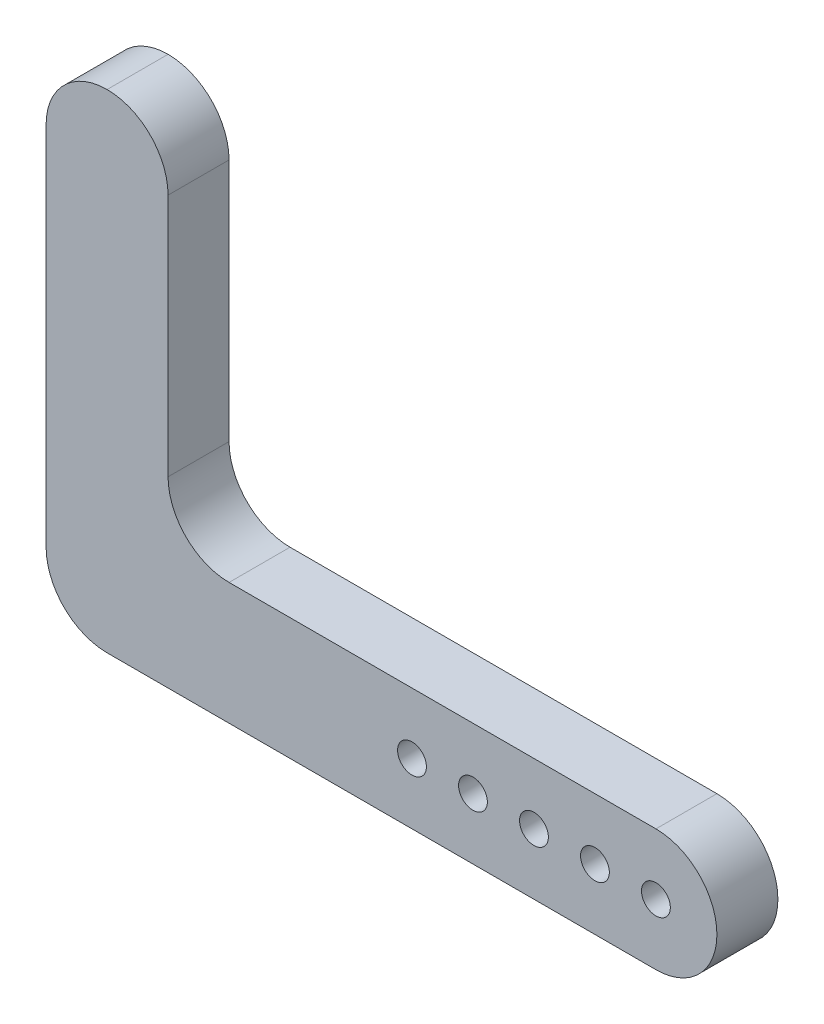
ISO-10303-21;
HEADER;
FILE_DESCRIPTION(('STEP AP214'),'2;1');
FILE_NAME('part.step','',(''),(''),'','','');
FILE_SCHEMA(('AUTOMOTIVE_DESIGN { 1 0 10303 214 1 1 1 1 }'));
ENDSEC;
DATA;
#1=APPLICATION_CONTEXT('core data for automotive mechanical design processes');
#2=APPLICATION_PROTOCOL_DEFINITION('international standard','automotive_design',2000,#1);
#3=PRODUCT_CONTEXT('',#1,'mechanical');
#4=PRODUCT('Part','Part','',(#3));
#5=PRODUCT_RELATED_PRODUCT_CATEGORY('part','',(#4));
#6=PRODUCT_DEFINITION_FORMATION('','',#4);
#7=PRODUCT_DEFINITION_CONTEXT('part definition',#1,'design');
#8=PRODUCT_DEFINITION('design','',#6,#7);
#9=PRODUCT_DEFINITION_SHAPE('','',#8);
#10=(LENGTH_UNIT() NAMED_UNIT(*) SI_UNIT(.MILLI.,.METRE.));
#11=(NAMED_UNIT(*) PLANE_ANGLE_UNIT() SI_UNIT($,.RADIAN.));
#12=(NAMED_UNIT(*) SI_UNIT($,.STERADIAN.) SOLID_ANGLE_UNIT());
#13=UNCERTAINTY_MEASURE_WITH_UNIT(LENGTH_MEASURE(1.E-05),#10,'distance_accuracy_value','');
#14=(GEOMETRIC_REPRESENTATION_CONTEXT(3) GLOBAL_UNCERTAINTY_ASSIGNED_CONTEXT((#13)) GLOBAL_UNIT_ASSIGNED_CONTEXT((#10,
#11,#12)) REPRESENTATION_CONTEXT('',''));
#15=CARTESIAN_POINT('',(0.,0.,0.));
#16=DIRECTION('',(0.,0.,1.));
#17=DIRECTION('',(1.,0.,0.));
#18=AXIS2_PLACEMENT_3D('',#15,#16,#17);
#19=CARTESIAN_POINT('',(0.,0.,6.35));
#20=DIRECTION('',(0.,0.,1.));
#21=DIRECTION('',(1.,0.,0.));
#22=AXIS2_PLACEMENT_3D('',#19,#20,#21);
#23=PLANE('',#22);
#24=CARTESIAN_POINT('',(-6.35,0.,6.35));
#25=DIRECTION('',(0.,0.,-1.));
#26=DIRECTION('',(-1.,0.,0.));
#27=AXIS2_PLACEMENT_3D('',#24,#25,#26);
#28=CIRCLE('',#27,1.5);
#29=CARTESIAN_POINT('',(-7.85,0.,6.35));
#30=VERTEX_POINT('',#29);
#31=EDGE_CURVE('E238',#30,#30,#28,.T.);
#32=ORIENTED_EDGE('',*,*,#31,.T.);
#33=EDGE_LOOP('',(#32));
#34=FACE_BOUND('',#33,.T.);
#35=CARTESIAN_POINT('',(-19.05,0.,6.35));
#36=DIRECTION('',(0.,0.,-1.));
#37=DIRECTION('',(-1.,0.,0.));
#38=AXIS2_PLACEMENT_3D('',#35,#36,#37);
#39=CIRCLE('',#38,1.5);
#40=CARTESIAN_POINT('',(-20.55,0.,6.35));
#41=VERTEX_POINT('',#40);
#42=EDGE_CURVE('E248',#41,#41,#39,.T.);
#43=ORIENTED_EDGE('',*,*,#42,.T.);
#44=EDGE_LOOP('',(#43));
#45=FACE_BOUND('',#44,.T.);
#46=CARTESIAN_POINT('',(-25.4,0.,6.35));
#47=DIRECTION('',(0.,0.,-1.));
#48=DIRECTION('',(-1.,0.,0.));
#49=AXIS2_PLACEMENT_3D('',#46,#47,#48);
#50=CIRCLE('',#49,1.5);
#51=CARTESIAN_POINT('',(-26.9,0.,6.35));
#52=VERTEX_POINT('',#51);
#53=EDGE_CURVE('E260',#52,#52,#50,.T.);
#54=ORIENTED_EDGE('',*,*,#53,.T.);
#55=EDGE_LOOP('',(#54));
#56=FACE_BOUND('',#55,.T.);
#57=CARTESIAN_POINT('',(-12.7,0.,6.35));
#58=DIRECTION('',(0.,0.,-1.));
#59=DIRECTION('',(-1.,0.,0.));
#60=AXIS2_PLACEMENT_3D('',#57,#58,#59);
#61=CIRCLE('',#60,1.5);
#62=CARTESIAN_POINT('',(-14.2,0.,6.35));
#63=VERTEX_POINT('',#62);
#64=EDGE_CURVE('E245',#63,#63,#61,.T.);
#65=ORIENTED_EDGE('',*,*,#64,.T.);
#66=EDGE_LOOP('',(#65));
#67=FACE_BOUND('',#66,.T.);
#68=CARTESIAN_POINT('',(-57.15,38.1,6.35));
#69=DIRECTION('',(0.,0.,1.));
#70=DIRECTION('',(1.,0.,0.));
#71=AXIS2_PLACEMENT_3D('',#68,#69,#70);
#72=CIRCLE('',#71,6.35);
#73=CARTESIAN_POINT('',(-50.8,38.1,6.35));
#74=VERTEX_POINT('',#73);
#75=CARTESIAN_POINT('',(-57.15,44.45,6.35));
#76=VERTEX_POINT('',#75);
#77=EDGE_CURVE('E56',#74,#76,#72,.T.);
#78=ORIENTED_EDGE('',*,*,#77,.T.);
#79=CARTESIAN_POINT('',(-57.15,38.1,6.35));
#80=DIRECTION('',(0.,0.,1.));
#81=DIRECTION('',(1.,0.,0.));
#82=AXIS2_PLACEMENT_3D('',#79,#80,#81);
#83=CIRCLE('',#82,6.35);
#84=CARTESIAN_POINT('',(-63.5,38.1,6.35));
#85=VERTEX_POINT('',#84);
#86=EDGE_CURVE('E147',#76,#85,#83,.T.);
#87=ORIENTED_EDGE('',*,*,#86,.T.);
#88=DIRECTION('',(0.,-1.,0.));
#89=VECTOR('',#88,1.);
#90=CARTESIAN_POINT('',(-63.5,44.45,6.35));
#91=LINE('',#90,#89);
#92=CARTESIAN_POINT('',(-63.5,0.,6.35));
#93=VERTEX_POINT('',#92);
#94=EDGE_CURVE('E173',#85,#93,#91,.T.);
#95=ORIENTED_EDGE('',*,*,#94,.T.);
#96=CARTESIAN_POINT('',(-57.15,0.,6.35));
#97=DIRECTION('',(0.,0.,1.));
#98=DIRECTION('',(1.,0.,0.));
#99=AXIS2_PLACEMENT_3D('',#96,#97,#98);
#100=CIRCLE('',#99,6.35);
#101=CARTESIAN_POINT('',(-57.15,-6.35,6.35));
#102=VERTEX_POINT('',#101);
#103=EDGE_CURVE('E49',#93,#102,#100,.T.);
#104=ORIENTED_EDGE('',*,*,#103,.T.);
#105=DIRECTION('',(1.,0.,0.));
#106=VECTOR('',#105,1.);
#107=CARTESIAN_POINT('',(-63.5,-6.35,6.35));
#108=LINE('',#107,#106);
#109=CARTESIAN_POINT('',(0.,-6.35,6.35));
#110=VERTEX_POINT('',#109);
#111=EDGE_CURVE('E120',#102,#110,#108,.T.);
#112=ORIENTED_EDGE('',*,*,#111,.T.);
#113=CARTESIAN_POINT('',(0.,0.,6.35));
#114=DIRECTION('',(0.,0.,1.));
#115=DIRECTION('',(1.,0.,0.));
#116=AXIS2_PLACEMENT_3D('',#113,#114,#115);
#117=CIRCLE('',#116,6.35);
#118=CARTESIAN_POINT('',(0.,6.35,6.35));
#119=VERTEX_POINT('',#118);
#120=EDGE_CURVE('E116',#110,#119,#117,.T.);
#121=ORIENTED_EDGE('',*,*,#120,.T.);
#122=DIRECTION('',(-1.,0.,0.));
#123=VECTOR('',#122,1.);
#124=CARTESIAN_POINT('',(0.,6.35,6.35));
#125=LINE('',#124,#123);
#126=CARTESIAN_POINT('',(-44.45,6.34999999999999,6.35));
#127=VERTEX_POINT('',#126);
#128=EDGE_CURVE('E105',#119,#127,#125,.T.);
#129=ORIENTED_EDGE('',*,*,#128,.T.);
#130=CARTESIAN_POINT('',(-44.45,12.7,6.35));
#131=DIRECTION('',(0.,0.,1.));
#132=DIRECTION('',(1.,0.,0.));
#133=AXIS2_PLACEMENT_3D('',#130,#131,#132);
#134=CIRCLE('',#133,6.35);
#135=CARTESIAN_POINT('',(-50.8,12.7,6.35));
#136=VERTEX_POINT('',#135);
#137=EDGE_CURVE('E11',#127,#136,#134,.F.);
#138=ORIENTED_EDGE('',*,*,#137,.T.);
#139=DIRECTION('',(0.,1.,0.));
#140=VECTOR('',#139,1.);
#141=CARTESIAN_POINT('',(-50.8,6.34999999999999,6.35));
#142=LINE('',#141,#140);
#143=EDGE_CURVE('E115',#136,#74,#142,.T.);
#144=ORIENTED_EDGE('',*,*,#143,.T.);
#145=EDGE_LOOP('',(#78,#87,#95,#104,#112,#121,#129,#138,#144));
#146=FACE_BOUND('',#145,.T.);
#147=CARTESIAN_POINT('',(0.,0.,6.35));
#148=DIRECTION('',(0.,0.,1.));
#149=DIRECTION('',(1.,0.,0.));
#150=AXIS2_PLACEMENT_3D('',#147,#148,#149);
#151=CIRCLE('',#150,1.5);
#152=CARTESIAN_POINT('',(1.5,0.,6.35));
#153=VERTEX_POINT('',#152);
#154=EDGE_CURVE('E178',#153,#153,#151,.T.);
#155=ORIENTED_EDGE('',*,*,#154,.F.);
#156=EDGE_LOOP('',(#155));
#157=FACE_BOUND('',#156,.T.);
#158=ADVANCED_FACE('F33',(#34,#45,#56,#67,#146,#157),#23,.T.);
#159=CARTESIAN_POINT('',(0.,0.,0.));
#160=DIRECTION('',(0.,0.,1.));
#161=DIRECTION('',(1.,0.,0.));
#162=AXIS2_PLACEMENT_3D('',#159,#160,#161);
#163=PLANE('',#162);
#164=CARTESIAN_POINT('',(-6.35,0.,0.));
#165=DIRECTION('',(0.,0.,-1.));
#166=DIRECTION('',(-1.,0.,0.));
#167=AXIS2_PLACEMENT_3D('',#164,#165,#166);
#168=CIRCLE('',#167,1.5);
#169=CARTESIAN_POINT('',(-7.85,0.,0.));
#170=VERTEX_POINT('',#169);
#171=EDGE_CURVE('E241',#170,#170,#168,.T.);
#172=ORIENTED_EDGE('',*,*,#171,.F.);
#173=EDGE_LOOP('',(#172));
#174=FACE_BOUND('',#173,.T.);
#175=CARTESIAN_POINT('',(-19.05,0.,0.));
#176=DIRECTION('',(0.,0.,-1.));
#177=DIRECTION('',(-1.,0.,0.));
#178=AXIS2_PLACEMENT_3D('',#175,#176,#177);
#179=CIRCLE('',#178,1.5);
#180=CARTESIAN_POINT('',(-20.55,0.,0.));
#181=VERTEX_POINT('',#180);
#182=EDGE_CURVE('E252',#181,#181,#179,.T.);
#183=ORIENTED_EDGE('',*,*,#182,.F.);
#184=EDGE_LOOP('',(#183));
#185=FACE_BOUND('',#184,.T.);
#186=CARTESIAN_POINT('',(-25.4,0.,0.));
#187=DIRECTION('',(0.,0.,-1.));
#188=DIRECTION('',(-1.,0.,0.));
#189=AXIS2_PLACEMENT_3D('',#186,#187,#188);
#190=CIRCLE('',#189,1.5);
#191=CARTESIAN_POINT('',(-26.9,0.,0.));
#192=VERTEX_POINT('',#191);
#193=EDGE_CURVE('E251',#192,#192,#190,.T.);
#194=ORIENTED_EDGE('',*,*,#193,.F.);
#195=EDGE_LOOP('',(#194));
#196=FACE_BOUND('',#195,.T.);
#197=CARTESIAN_POINT('',(-12.7,0.,0.));
#198=DIRECTION('',(0.,0.,-1.));
#199=DIRECTION('',(-1.,0.,0.));
#200=AXIS2_PLACEMENT_3D('',#197,#198,#199);
#201=CIRCLE('',#200,1.5);
#202=CARTESIAN_POINT('',(-14.2,0.,0.));
#203=VERTEX_POINT('',#202);
#204=EDGE_CURVE('E257',#203,#203,#201,.T.);
#205=ORIENTED_EDGE('',*,*,#204,.F.);
#206=EDGE_LOOP('',(#205));
#207=FACE_BOUND('',#206,.T.);
#208=DIRECTION('',(0.,-1.,0.));
#209=VECTOR('',#208,1.);
#210=CARTESIAN_POINT('',(-63.5,44.45,0.));
#211=LINE('',#210,#209);
#212=CARTESIAN_POINT('',(-63.5,38.1,0.));
#213=VERTEX_POINT('',#212);
#214=CARTESIAN_POINT('',(-63.5,0.,0.));
#215=VERTEX_POINT('',#214);
#216=EDGE_CURVE('E181',#213,#215,#211,.T.);
#217=ORIENTED_EDGE('',*,*,#216,.F.);
#218=CARTESIAN_POINT('',(-57.15,38.1,0.));
#219=DIRECTION('',(0.,0.,1.));
#220=DIRECTION('',(1.,0.,0.));
#221=AXIS2_PLACEMENT_3D('',#218,#219,#220);
#222=CIRCLE('',#221,6.35);
#223=CARTESIAN_POINT('',(-57.15,44.45,0.));
#224=VERTEX_POINT('',#223);
#225=EDGE_CURVE('E143',#213,#224,#222,.F.);
#226=ORIENTED_EDGE('',*,*,#225,.T.);
#227=CARTESIAN_POINT('',(-57.15,38.1,0.));
#228=DIRECTION('',(0.,0.,1.));
#229=DIRECTION('',(1.,0.,0.));
#230=AXIS2_PLACEMENT_3D('',#227,#228,#229);
#231=CIRCLE('',#230,6.35);
#232=CARTESIAN_POINT('',(-50.8,38.1,0.));
#233=VERTEX_POINT('',#232);
#234=EDGE_CURVE('E141',#224,#233,#231,.F.);
#235=ORIENTED_EDGE('',*,*,#234,.T.);
#236=DIRECTION('',(0.,1.,0.));
#237=VECTOR('',#236,1.);
#238=CARTESIAN_POINT('',(-50.8,6.34999999999999,0.));
#239=LINE('',#238,#237);
#240=CARTESIAN_POINT('',(-50.8,12.7,0.));
#241=VERTEX_POINT('',#240);
#242=EDGE_CURVE('E165',#241,#233,#239,.T.);
#243=ORIENTED_EDGE('',*,*,#242,.F.);
#244=CARTESIAN_POINT('',(-44.45,12.7,0.));
#245=DIRECTION('',(0.,0.,1.));
#246=DIRECTION('',(1.,0.,0.));
#247=AXIS2_PLACEMENT_3D('',#244,#245,#246);
#248=CIRCLE('',#247,6.35);
#249=CARTESIAN_POINT('',(-44.45,6.34999999999999,0.));
#250=VERTEX_POINT('',#249);
#251=EDGE_CURVE('E42',#241,#250,#248,.T.);
#252=ORIENTED_EDGE('',*,*,#251,.T.);
#253=DIRECTION('',(-1.,0.,0.));
#254=VECTOR('',#253,1.);
#255=CARTESIAN_POINT('',(0.,6.35,0.));
#256=LINE('',#255,#254);
#257=CARTESIAN_POINT('',(0.,6.35,0.));
#258=VERTEX_POINT('',#257);
#259=EDGE_CURVE('E163',#258,#250,#256,.T.);
#260=ORIENTED_EDGE('',*,*,#259,.F.);
#261=CARTESIAN_POINT('',(0.,0.,0.));
#262=DIRECTION('',(0.,0.,1.));
#263=DIRECTION('',(1.,0.,0.));
#264=AXIS2_PLACEMENT_3D('',#261,#262,#263);
#265=CIRCLE('',#264,6.35);
#266=CARTESIAN_POINT('',(0.,-6.35,0.));
#267=VERTEX_POINT('',#266);
#268=EDGE_CURVE('E128',#267,#258,#265,.T.);
#269=ORIENTED_EDGE('',*,*,#268,.F.);
#270=DIRECTION('',(1.,0.,0.));
#271=VECTOR('',#270,1.);
#272=CARTESIAN_POINT('',(-63.5,-6.35,0.));
#273=LINE('',#272,#271);
#274=CARTESIAN_POINT('',(-57.15,-6.35,0.));
#275=VERTEX_POINT('',#274);
#276=EDGE_CURVE('E124',#275,#267,#273,.T.);
#277=ORIENTED_EDGE('',*,*,#276,.F.);
#278=CARTESIAN_POINT('',(-57.15,0.,0.));
#279=DIRECTION('',(0.,0.,1.));
#280=DIRECTION('',(1.,0.,0.));
#281=AXIS2_PLACEMENT_3D('',#278,#279,#280);
#282=CIRCLE('',#281,6.35);
#283=EDGE_CURVE('E139',#275,#215,#282,.F.);
#284=ORIENTED_EDGE('',*,*,#283,.T.);
#285=EDGE_LOOP('',(#217,#226,#235,#243,#252,#260,#269,#277,#284));
#286=FACE_BOUND('',#285,.T.);
#287=CARTESIAN_POINT('',(0.,0.,0.));
#288=DIRECTION('',(0.,0.,1.));
#289=DIRECTION('',(1.,0.,0.));
#290=AXIS2_PLACEMENT_3D('',#287,#288,#289);
#291=CIRCLE('',#290,1.5);
#292=CARTESIAN_POINT('',(1.5,0.,0.));
#293=VERTEX_POINT('',#292);
#294=EDGE_CURVE('E237',#293,#293,#291,.T.);
#295=ORIENTED_EDGE('',*,*,#294,.T.);
#296=EDGE_LOOP('',(#295));
#297=FACE_BOUND('',#296,.T.);
#298=ADVANCED_FACE('F161',(#174,#185,#196,#207,#286,#297),#163,.F.);
#299=CARTESIAN_POINT('',(0.,0.,6.35));
#300=DIRECTION('',(0.,0.,-1.));
#301=DIRECTION('',(-1.,0.,0.));
#302=AXIS2_PLACEMENT_3D('',#299,#300,#301);
#303=CYLINDRICAL_SURFACE('',#302,6.35);
#304=ORIENTED_EDGE('',*,*,#268,.T.);
#305=DIRECTION('',(0.,0.,-1.));
#306=VECTOR('',#305,1.);
#307=CARTESIAN_POINT('',(0.,6.35,6.35));
#308=LINE('',#307,#306);
#309=EDGE_CURVE('E110',#119,#258,#308,.T.);
#310=ORIENTED_EDGE('',*,*,#309,.F.);
#311=ORIENTED_EDGE('',*,*,#120,.F.);
#312=DIRECTION('',(0.,0.,-1.));
#313=VECTOR('',#312,1.);
#314=CARTESIAN_POINT('',(0.,-6.35,6.35));
#315=LINE('',#314,#313);
#316=EDGE_CURVE('E130',#110,#267,#315,.T.);
#317=ORIENTED_EDGE('',*,*,#316,.T.);
#318=EDGE_LOOP('',(#304,#310,#311,#317));
#319=FACE_BOUND('',#318,.T.);
#320=ADVANCED_FACE('F126',(#319),#303,.T.);
#321=CARTESIAN_POINT('',(0.,6.35,6.35));
#322=DIRECTION('',(0.,-1.,0.));
#323=DIRECTION('',(1.,0.,0.));
#324=AXIS2_PLACEMENT_3D('',#321,#322,#323);
#325=PLANE('',#324);
#326=ORIENTED_EDGE('',*,*,#259,.T.);
#327=DIRECTION('',(0.,0.,-1.));
#328=VECTOR('',#327,1.);
#329=CARTESIAN_POINT('',(-44.45,6.34999999999999,6.35));
#330=LINE('',#329,#328);
#331=EDGE_CURVE('E113',#250,#127,#330,.F.);
#332=ORIENTED_EDGE('',*,*,#331,.T.);
#333=ORIENTED_EDGE('',*,*,#128,.F.);
#334=ORIENTED_EDGE('',*,*,#309,.T.);
#335=EDGE_LOOP('',(#326,#332,#333,#334));
#336=FACE_BOUND('',#335,.T.);
#337=ADVANCED_FACE('F108',(#336),#325,.F.);
#338=CARTESIAN_POINT('',(-50.8,6.34999999999999,6.35));
#339=DIRECTION('',(-1.,0.,0.));
#340=DIRECTION('',(0.,-1.,0.));
#341=AXIS2_PLACEMENT_3D('',#338,#339,#340);
#342=PLANE('',#341);
#343=ORIENTED_EDGE('',*,*,#242,.T.);
#344=DIRECTION('',(0.,0.,-1.));
#345=VECTOR('',#344,1.);
#346=CARTESIAN_POINT('',(-50.8,38.1,6.35));
#347=LINE('',#346,#345);
#348=EDGE_CURVE('E152',#233,#74,#347,.F.);
#349=ORIENTED_EDGE('',*,*,#348,.T.);
#350=ORIENTED_EDGE('',*,*,#143,.F.);
#351=DIRECTION('',(0.,0.,-1.));
#352=VECTOR('',#351,1.);
#353=CARTESIAN_POINT('',(-50.8,12.7,0.));
#354=LINE('',#353,#352);
#355=EDGE_CURVE('E149',#136,#241,#354,.T.);
#356=ORIENTED_EDGE('',*,*,#355,.T.);
#357=EDGE_LOOP('',(#343,#349,#350,#356));
#358=FACE_BOUND('',#357,.T.);
#359=ADVANCED_FACE('F171',(#358),#342,.F.);
#360=CARTESIAN_POINT('',(-63.5,44.45,6.35));
#361=DIRECTION('',(1.,0.,0.));
#362=DIRECTION('',(0.,0.,-1.));
#363=AXIS2_PLACEMENT_3D('',#360,#361,#362);
#364=PLANE('',#363);
#365=ORIENTED_EDGE('',*,*,#94,.F.);
#366=DIRECTION('',(0.,0.,-1.));
#367=VECTOR('',#366,1.);
#368=CARTESIAN_POINT('',(-63.5,38.1,6.35));
#369=LINE('',#368,#367);
#370=EDGE_CURVE('E132',#85,#213,#369,.T.);
#371=ORIENTED_EDGE('',*,*,#370,.T.);
#372=ORIENTED_EDGE('',*,*,#216,.T.);
#373=DIRECTION('',(0.,0.,-1.));
#374=VECTOR('',#373,1.);
#375=CARTESIAN_POINT('',(-63.5,0.,6.35));
#376=LINE('',#375,#374);
#377=EDGE_CURVE('E129',#215,#93,#376,.F.);
#378=ORIENTED_EDGE('',*,*,#377,.T.);
#379=EDGE_LOOP('',(#365,#371,#372,#378));
#380=FACE_BOUND('',#379,.T.);
#381=ADVANCED_FACE('F191',(#380),#364,.F.);
#382=CARTESIAN_POINT('',(-63.5,-6.35,6.35));
#383=DIRECTION('',(0.,1.,0.));
#384=DIRECTION('',(0.,0.,1.));
#385=AXIS2_PLACEMENT_3D('',#382,#383,#384);
#386=PLANE('',#385);
#387=ORIENTED_EDGE('',*,*,#111,.F.);
#388=DIRECTION('',(0.,0.,-1.));
#389=VECTOR('',#388,1.);
#390=CARTESIAN_POINT('',(-57.15,-6.35,6.35));
#391=LINE('',#390,#389);
#392=EDGE_CURVE('E154',#102,#275,#391,.T.);
#393=ORIENTED_EDGE('',*,*,#392,.T.);
#394=ORIENTED_EDGE('',*,*,#276,.T.);
#395=ORIENTED_EDGE('',*,*,#316,.F.);
#396=EDGE_LOOP('',(#387,#393,#394,#395));
#397=FACE_BOUND('',#396,.T.);
#398=ADVANCED_FACE('F185',(#397),#386,.F.);
#399=CARTESIAN_POINT('',(0.,0.,6.35));
#400=DIRECTION('',(0.,0.,-1.));
#401=DIRECTION('',(-1.,0.,0.));
#402=AXIS2_PLACEMENT_3D('',#399,#400,#401);
#403=CYLINDRICAL_SURFACE('',#402,1.5);
#404=ORIENTED_EDGE('',*,*,#154,.T.);
#405=EDGE_LOOP('',(#404));
#406=FACE_BOUND('',#405,.T.);
#407=ORIENTED_EDGE('',*,*,#294,.F.);
#408=EDGE_LOOP('',(#407));
#409=FACE_BOUND('',#408,.T.);
#410=ADVANCED_FACE('F216',(#406,#409),#403,.F.);
#411=CARTESIAN_POINT('',(-57.15,38.1,6.35));
#412=DIRECTION('',(0.,0.,-1.));
#413=DIRECTION('',(-1.,0.,0.));
#414=AXIS2_PLACEMENT_3D('',#411,#412,#413);
#415=CYLINDRICAL_SURFACE('',#414,6.35);
#416=DIRECTION('',(0.,0.,-1.));
#417=VECTOR('',#416,1.);
#418=CARTESIAN_POINT('',(-57.15,44.45,6.35));
#419=LINE('',#418,#417);
#420=EDGE_CURVE('E37',#76,#224,#419,.T.);
#421=ORIENTED_EDGE('',*,*,#420,.F.);
#422=ORIENTED_EDGE('',*,*,#77,.F.);
#423=ORIENTED_EDGE('',*,*,#348,.F.);
#424=ORIENTED_EDGE('',*,*,#234,.F.);
#425=EDGE_LOOP('',(#421,#422,#423,#424));
#426=FACE_BOUND('',#425,.T.);
#427=ADVANCED_FACE('F201',(#426),#415,.T.);
#428=CARTESIAN_POINT('',(-57.15,38.1,6.35));
#429=DIRECTION('',(0.,0.,-1.));
#430=DIRECTION('',(-1.,0.,0.));
#431=AXIS2_PLACEMENT_3D('',#428,#429,#430);
#432=CYLINDRICAL_SURFACE('',#431,6.35);
#433=ORIENTED_EDGE('',*,*,#86,.F.);
#434=ORIENTED_EDGE('',*,*,#420,.T.);
#435=ORIENTED_EDGE('',*,*,#225,.F.);
#436=ORIENTED_EDGE('',*,*,#370,.F.);
#437=EDGE_LOOP('',(#433,#434,#435,#436));
#438=FACE_BOUND('',#437,.T.);
#439=ADVANCED_FACE('F195',(#438),#432,.T.);
#440=CARTESIAN_POINT('',(-57.15,0.,6.35));
#441=DIRECTION('',(0.,0.,-1.));
#442=DIRECTION('',(-1.,0.,0.));
#443=AXIS2_PLACEMENT_3D('',#440,#441,#442);
#444=CYLINDRICAL_SURFACE('',#443,6.35);
#445=ORIENTED_EDGE('',*,*,#103,.F.);
#446=ORIENTED_EDGE('',*,*,#377,.F.);
#447=ORIENTED_EDGE('',*,*,#283,.F.);
#448=ORIENTED_EDGE('',*,*,#392,.F.);
#449=EDGE_LOOP('',(#445,#446,#447,#448));
#450=FACE_BOUND('',#449,.T.);
#451=ADVANCED_FACE('F193',(#450),#444,.T.);
#452=CARTESIAN_POINT('',(-44.45,12.7,6.35));
#453=DIRECTION('',(0.,0.,1.));
#454=DIRECTION('',(1.,0.,0.));
#455=AXIS2_PLACEMENT_3D('',#452,#453,#454);
#456=CYLINDRICAL_SURFACE('',#455,6.35);
#457=ORIENTED_EDGE('',*,*,#137,.F.);
#458=ORIENTED_EDGE('',*,*,#331,.F.);
#459=ORIENTED_EDGE('',*,*,#251,.F.);
#460=ORIENTED_EDGE('',*,*,#355,.F.);
#461=EDGE_LOOP('',(#457,#458,#459,#460));
#462=FACE_BOUND('',#461,.T.);
#463=ADVANCED_FACE('F35',(#462),#456,.F.);
#464=CARTESIAN_POINT('',(-12.7,0.,6.35));
#465=DIRECTION('',(0.,0.,-1.));
#466=DIRECTION('',(-1.,0.,0.));
#467=AXIS2_PLACEMENT_3D('',#464,#465,#466);
#468=CYLINDRICAL_SURFACE('',#467,1.5);
#469=ORIENTED_EDGE('',*,*,#64,.F.);
#470=EDGE_LOOP('',(#469));
#471=FACE_BOUND('',#470,.T.);
#472=ORIENTED_EDGE('',*,*,#204,.T.);
#473=EDGE_LOOP('',(#472));
#474=FACE_BOUND('',#473,.T.);
#475=ADVANCED_FACE('F200',(#471,#474),#468,.F.);
#476=CARTESIAN_POINT('',(-25.4,0.,6.35));
#477=DIRECTION('',(0.,0.,-1.));
#478=DIRECTION('',(-1.,0.,0.));
#479=AXIS2_PLACEMENT_3D('',#476,#477,#478);
#480=CYLINDRICAL_SURFACE('',#479,1.5);
#481=ORIENTED_EDGE('',*,*,#53,.F.);
#482=EDGE_LOOP('',(#481));
#483=FACE_BOUND('',#482,.T.);
#484=ORIENTED_EDGE('',*,*,#193,.T.);
#485=EDGE_LOOP('',(#484));
#486=FACE_BOUND('',#485,.T.);
#487=ADVANCED_FACE('F271',(#483,#486),#480,.F.);
#488=CARTESIAN_POINT('',(-19.05,0.,6.35));
#489=DIRECTION('',(0.,0.,-1.));
#490=DIRECTION('',(-1.,0.,0.));
#491=AXIS2_PLACEMENT_3D('',#488,#489,#490);
#492=CYLINDRICAL_SURFACE('',#491,1.5);
#493=ORIENTED_EDGE('',*,*,#42,.F.);
#494=EDGE_LOOP('',(#493));
#495=FACE_BOUND('',#494,.T.);
#496=ORIENTED_EDGE('',*,*,#182,.T.);
#497=EDGE_LOOP('',(#496));
#498=FACE_BOUND('',#497,.T.);
#499=ADVANCED_FACE('F282',(#495,#498),#492,.F.);
#500=CARTESIAN_POINT('',(-6.35,0.,6.35));
#501=DIRECTION('',(0.,0.,-1.));
#502=DIRECTION('',(-1.,0.,0.));
#503=AXIS2_PLACEMENT_3D('',#500,#501,#502);
#504=CYLINDRICAL_SURFACE('',#503,1.5);
#505=ORIENTED_EDGE('',*,*,#31,.F.);
#506=EDGE_LOOP('',(#505));
#507=FACE_BOUND('',#506,.T.);
#508=ORIENTED_EDGE('',*,*,#171,.T.);
#509=EDGE_LOOP('',(#508));
#510=FACE_BOUND('',#509,.T.);
#511=ADVANCED_FACE('F288',(#507,#510),#504,.F.);
#512=CLOSED_SHELL('',(#158,#298,#320,#337,#359,#381,#398,#410,#427,#439,#451,#463,#475,#487,
#499,#511));
#513=MANIFOLD_SOLID_BREP('B2',#512);
#514=ADVANCED_BREP_SHAPE_REPRESENTATION('',(#18,#513),#14);
#515=SHAPE_DEFINITION_REPRESENTATION(#9,#514);
ENDSEC;
END-ISO-10303-21;
